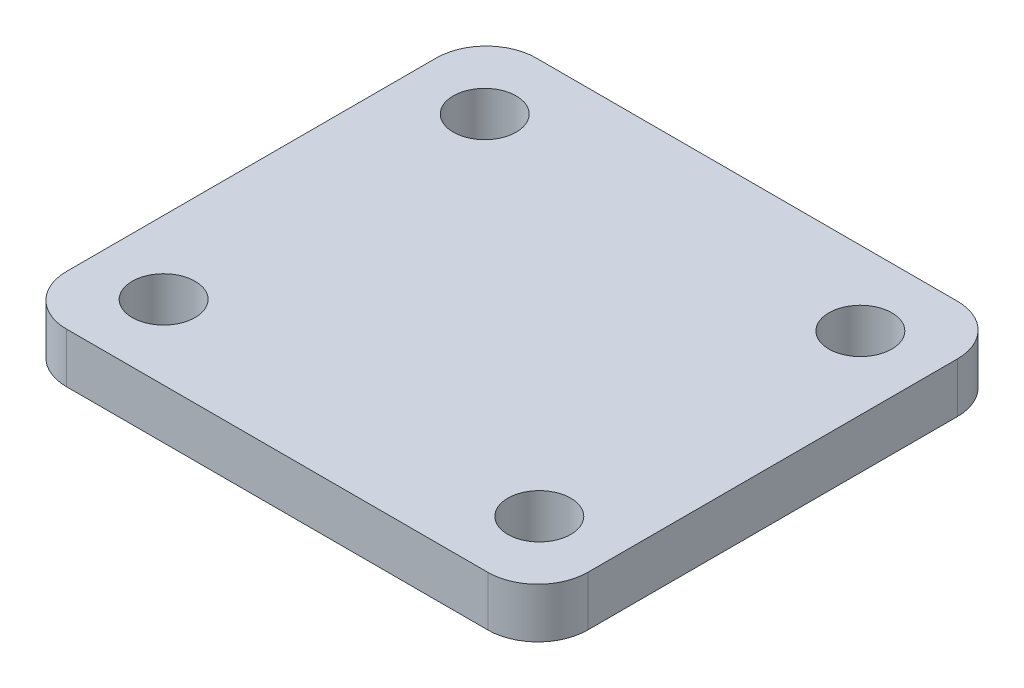
ISO-10303-21;
HEADER;
FILE_DESCRIPTION(('STEP AP214'),'2;1');
FILE_NAME('part.step','',(''),(''),'','','');
FILE_SCHEMA(('AUTOMOTIVE_DESIGN { 1 0 10303 214 1 1 1 1 }'));
ENDSEC;
DATA;
#1=APPLICATION_CONTEXT('core data for automotive mechanical design processes');
#2=APPLICATION_PROTOCOL_DEFINITION('international standard','automotive_design',2000,#1);
#3=PRODUCT_CONTEXT('',#1,'mechanical');
#4=PRODUCT('Part','Part','',(#3));
#5=PRODUCT_RELATED_PRODUCT_CATEGORY('part','',(#4));
#6=PRODUCT_DEFINITION_FORMATION('','',#4);
#7=PRODUCT_DEFINITION_CONTEXT('part definition',#1,'design');
#8=PRODUCT_DEFINITION('design','',#6,#7);
#9=PRODUCT_DEFINITION_SHAPE('','',#8);
#10=(LENGTH_UNIT() NAMED_UNIT(*) SI_UNIT(.MILLI.,.METRE.));
#11=(NAMED_UNIT(*) PLANE_ANGLE_UNIT() SI_UNIT($,.RADIAN.));
#12=(NAMED_UNIT(*) SI_UNIT($,.STERADIAN.) SOLID_ANGLE_UNIT());
#13=UNCERTAINTY_MEASURE_WITH_UNIT(LENGTH_MEASURE(1.E-05),#10,'distance_accuracy_value','');
#14=(GEOMETRIC_REPRESENTATION_CONTEXT(3) GLOBAL_UNCERTAINTY_ASSIGNED_CONTEXT((#13)) GLOBAL_UNIT_ASSIGNED_CONTEXT((#10,
#11,#12)) REPRESENTATION_CONTEXT('',''));
#15=CARTESIAN_POINT('',(0.,0.,0.));
#16=DIRECTION('',(0.,0.,1.));
#17=DIRECTION('',(1.,0.,0.));
#18=AXIS2_PLACEMENT_3D('',#15,#16,#17);
#19=CARTESIAN_POINT('',(10.709999957,2.54,-9.397499999));
#20=DIRECTION('',(0.,-1.,0.));
#21=DIRECTION('',(0.,0.,-1.));
#22=AXIS2_PLACEMENT_3D('',#19,#20,#21);
#23=CYLINDRICAL_SURFACE('',#22,2.54);
#24=CARTESIAN_POINT('',(10.709999957,0.,-9.397499999));
#25=DIRECTION('',(0.,1.,0.));
#26=DIRECTION('',(0.,0.,-1.));
#27=AXIS2_PLACEMENT_3D('',#24,#25,#26);
#28=CIRCLE('',#27,2.54);
#29=CARTESIAN_POINT('',(13.249999957,0.,-9.39749999899998));
#30=VERTEX_POINT('',#29);
#31=CARTESIAN_POINT('',(10.709999957,0.,-11.937499999));
#32=VERTEX_POINT('',#31);
#33=EDGE_CURVE('E139',#30,#32,#28,.T.);
#34=ORIENTED_EDGE('',*,*,#33,.T.);
#35=DIRECTION('',(0.,-1.,0.));
#36=VECTOR('',#35,1.);
#37=CARTESIAN_POINT('',(10.709999957,2.54,-11.937499999));
#38=LINE('',#37,#36);
#39=CARTESIAN_POINT('',(10.709999957,2.54,-11.937499999));
#40=VERTEX_POINT('',#39);
#41=EDGE_CURVE('E11',#40,#32,#38,.T.);
#42=ORIENTED_EDGE('',*,*,#41,.F.);
#43=CARTESIAN_POINT('',(10.709999957,2.54,-9.397499999));
#44=DIRECTION('',(0.,1.,0.));
#45=DIRECTION('',(0.,0.,-1.));
#46=AXIS2_PLACEMENT_3D('',#43,#44,#45);
#47=CIRCLE('',#46,2.54);
#48=CARTESIAN_POINT('',(13.249999957,2.54,-9.39749999899998));
#49=VERTEX_POINT('',#48);
#50=EDGE_CURVE('E154',#49,#40,#47,.T.);
#51=ORIENTED_EDGE('',*,*,#50,.F.);
#52=DIRECTION('',(0.,-1.,0.));
#53=VECTOR('',#52,1.);
#54=CARTESIAN_POINT('',(13.249999957,2.54,-9.39749999899998));
#55=LINE('',#54,#53);
#56=EDGE_CURVE('E135',#49,#30,#55,.T.);
#57=ORIENTED_EDGE('',*,*,#56,.T.);
#58=EDGE_LOOP('',(#34,#42,#51,#57));
#59=FACE_BOUND('',#58,.T.);
#60=ADVANCED_FACE('F43',(#59),#23,.T.);
#61=CARTESIAN_POINT('',(-10.710000043,2.54,-11.937499999));
#62=DIRECTION('',(0.,0.,1.));
#63=DIRECTION('',(1.,0.,0.));
#64=AXIS2_PLACEMENT_3D('',#61,#62,#63);
#65=PLANE('',#64);
#66=DIRECTION('',(-1.,0.,0.));
#67=VECTOR('',#66,1.);
#68=CARTESIAN_POINT('',(-10.710000043,0.,-11.937499999));
#69=LINE('',#68,#67);
#70=CARTESIAN_POINT('',(-10.710000043,0.,-11.937499999));
#71=VERTEX_POINT('',#70);
#72=EDGE_CURVE('E142',#32,#71,#69,.T.);
#73=ORIENTED_EDGE('',*,*,#72,.T.);
#74=DIRECTION('',(0.,-1.,0.));
#75=VECTOR('',#74,1.);
#76=CARTESIAN_POINT('',(-10.710000043,2.54,-11.937499999));
#77=LINE('',#76,#75);
#78=CARTESIAN_POINT('',(-10.710000043,2.54,-11.937499999));
#79=VERTEX_POINT('',#78);
#80=EDGE_CURVE('E51',#79,#71,#77,.T.);
#81=ORIENTED_EDGE('',*,*,#80,.F.);
#82=DIRECTION('',(-1.,0.,0.));
#83=VECTOR('',#82,1.);
#84=CARTESIAN_POINT('',(-10.710000043,2.54,-11.937499999));
#85=LINE('',#84,#83);
#86=EDGE_CURVE('E102',#40,#79,#85,.T.);
#87=ORIENTED_EDGE('',*,*,#86,.F.);
#88=ORIENTED_EDGE('',*,*,#41,.T.);
#89=EDGE_LOOP('',(#73,#81,#87,#88));
#90=FACE_BOUND('',#89,.T.);
#91=ADVANCED_FACE('F236',(#90),#65,.F.);
#92=CARTESIAN_POINT('',(-10.710000043,2.54,-9.397499999));
#93=DIRECTION('',(0.,-1.,0.));
#94=DIRECTION('',(0.,0.,-1.));
#95=AXIS2_PLACEMENT_3D('',#92,#93,#94);
#96=CYLINDRICAL_SURFACE('',#95,2.54);
#97=CARTESIAN_POINT('',(-10.710000043,0.,-9.397499999));
#98=DIRECTION('',(0.,1.,0.));
#99=DIRECTION('',(0.,0.,-1.));
#100=AXIS2_PLACEMENT_3D('',#97,#98,#99);
#101=CIRCLE('',#100,2.54);
#102=CARTESIAN_POINT('',(-13.250000043,0.,-9.39749999899998));
#103=VERTEX_POINT('',#102);
#104=EDGE_CURVE('E145',#71,#103,#101,.T.);
#105=ORIENTED_EDGE('',*,*,#104,.T.);
#106=DIRECTION('',(0.,-1.,0.));
#107=VECTOR('',#106,1.);
#108=CARTESIAN_POINT('',(-13.250000043,2.54,-9.39749999899998));
#109=LINE('',#108,#107);
#110=CARTESIAN_POINT('',(-13.250000043,2.54,-9.39749999899998));
#111=VERTEX_POINT('',#110);
#112=EDGE_CURVE('E161',#111,#103,#109,.T.);
#113=ORIENTED_EDGE('',*,*,#112,.F.);
#114=CARTESIAN_POINT('',(-10.710000043,2.54,-9.397499999));
#115=DIRECTION('',(0.,1.,0.));
#116=DIRECTION('',(0.,0.,-1.));
#117=AXIS2_PLACEMENT_3D('',#114,#115,#116);
#118=CIRCLE('',#117,2.54);
#119=EDGE_CURVE('E169',#79,#111,#118,.T.);
#120=ORIENTED_EDGE('',*,*,#119,.F.);
#121=ORIENTED_EDGE('',*,*,#80,.T.);
#122=EDGE_LOOP('',(#105,#113,#120,#121));
#123=FACE_BOUND('',#122,.T.);
#124=ADVANCED_FACE('F167',(#123),#96,.T.);
#125=CARTESIAN_POINT('',(-13.250000043,2.54,9.39750000099998));
#126=DIRECTION('',(1.,0.,0.));
#127=DIRECTION('',(0.,0.,-1.));
#128=AXIS2_PLACEMENT_3D('',#125,#126,#127);
#129=PLANE('',#128);
#130=DIRECTION('',(0.,0.,1.));
#131=VECTOR('',#130,1.);
#132=CARTESIAN_POINT('',(-13.250000043,0.,9.39750000099998));
#133=LINE('',#132,#131);
#134=CARTESIAN_POINT('',(-13.250000043,0.,9.39750000099998));
#135=VERTEX_POINT('',#134);
#136=EDGE_CURVE('E147',#103,#135,#133,.T.);
#137=ORIENTED_EDGE('',*,*,#136,.T.);
#138=DIRECTION('',(0.,-1.,0.));
#139=VECTOR('',#138,1.);
#140=CARTESIAN_POINT('',(-13.250000043,2.54,9.39750000099998));
#141=LINE('',#140,#139);
#142=CARTESIAN_POINT('',(-13.250000043,2.54,9.39750000099998));
#143=VERTEX_POINT('',#142);
#144=EDGE_CURVE('E158',#143,#135,#141,.T.);
#145=ORIENTED_EDGE('',*,*,#144,.F.);
#146=DIRECTION('',(0.,0.,1.));
#147=VECTOR('',#146,1.);
#148=CARTESIAN_POINT('',(-13.250000043,2.54,9.39750000099998));
#149=LINE('',#148,#147);
#150=EDGE_CURVE('E181',#111,#143,#149,.T.);
#151=ORIENTED_EDGE('',*,*,#150,.F.);
#152=ORIENTED_EDGE('',*,*,#112,.T.);
#153=EDGE_LOOP('',(#137,#145,#151,#152));
#154=FACE_BOUND('',#153,.T.);
#155=ADVANCED_FACE('F177',(#154),#129,.F.);
#156=CARTESIAN_POINT('',(-10.710000043,2.54,9.397500001));
#157=DIRECTION('',(0.,-1.,0.));
#158=DIRECTION('',(0.,0.,-1.));
#159=AXIS2_PLACEMENT_3D('',#156,#157,#158);
#160=CYLINDRICAL_SURFACE('',#159,2.54);
#161=CARTESIAN_POINT('',(-10.710000043,0.,9.397500001));
#162=DIRECTION('',(0.,1.,0.));
#163=DIRECTION('',(0.,0.,-1.));
#164=AXIS2_PLACEMENT_3D('',#161,#162,#163);
#165=CIRCLE('',#164,2.54);
#166=CARTESIAN_POINT('',(-10.710000043,0.,11.937500001));
#167=VERTEX_POINT('',#166);
#168=EDGE_CURVE('E149',#135,#167,#165,.T.);
#169=ORIENTED_EDGE('',*,*,#168,.T.);
#170=DIRECTION('',(0.,-1.,0.));
#171=VECTOR('',#170,1.);
#172=CARTESIAN_POINT('',(-10.710000043,2.54,11.937500001));
#173=LINE('',#172,#171);
#174=CARTESIAN_POINT('',(-10.710000043,2.54,11.937500001));
#175=VERTEX_POINT('',#174);
#176=EDGE_CURVE('E130',#175,#167,#173,.T.);
#177=ORIENTED_EDGE('',*,*,#176,.F.);
#178=CARTESIAN_POINT('',(-10.710000043,2.54,9.397500001));
#179=DIRECTION('',(0.,1.,0.));
#180=DIRECTION('',(0.,0.,-1.));
#181=AXIS2_PLACEMENT_3D('',#178,#179,#180);
#182=CIRCLE('',#181,2.54);
#183=EDGE_CURVE('E121',#143,#175,#182,.T.);
#184=ORIENTED_EDGE('',*,*,#183,.F.);
#185=ORIENTED_EDGE('',*,*,#144,.T.);
#186=EDGE_LOOP('',(#169,#177,#184,#185));
#187=FACE_BOUND('',#186,.T.);
#188=ADVANCED_FACE('F180',(#187),#160,.T.);
#189=CARTESIAN_POINT('',(-10.710000043,2.54,11.937500001));
#190=DIRECTION('',(0.,0.,-1.));
#191=DIRECTION('',(-1.,0.,0.));
#192=AXIS2_PLACEMENT_3D('',#189,#190,#191);
#193=PLANE('',#192);
#194=DIRECTION('',(1.,0.,0.));
#195=VECTOR('',#194,1.);
#196=CARTESIAN_POINT('',(-10.710000043,0.,11.937500001));
#197=LINE('',#196,#195);
#198=CARTESIAN_POINT('',(10.709999957,0.,11.937500001));
#199=VERTEX_POINT('',#198);
#200=EDGE_CURVE('E129',#167,#199,#197,.T.);
#201=ORIENTED_EDGE('',*,*,#200,.T.);
#202=DIRECTION('',(0.,-1.,0.));
#203=VECTOR('',#202,1.);
#204=CARTESIAN_POINT('',(10.709999957,2.54,11.937500001));
#205=LINE('',#204,#203);
#206=CARTESIAN_POINT('',(10.709999957,2.54,11.937500001));
#207=VERTEX_POINT('',#206);
#208=EDGE_CURVE('E126',#207,#199,#205,.T.);
#209=ORIENTED_EDGE('',*,*,#208,.F.);
#210=DIRECTION('',(1.,0.,0.));
#211=VECTOR('',#210,1.);
#212=CARTESIAN_POINT('',(-10.710000043,2.54,11.937500001));
#213=LINE('',#212,#211);
#214=EDGE_CURVE('E115',#175,#207,#213,.T.);
#215=ORIENTED_EDGE('',*,*,#214,.F.);
#216=ORIENTED_EDGE('',*,*,#176,.T.);
#217=EDGE_LOOP('',(#201,#209,#215,#216));
#218=FACE_BOUND('',#217,.T.);
#219=ADVANCED_FACE('F127',(#218),#193,.F.);
#220=CARTESIAN_POINT('',(10.709999957,2.54,9.397500001));
#221=DIRECTION('',(0.,-1.,0.));
#222=DIRECTION('',(0.,0.,-1.));
#223=AXIS2_PLACEMENT_3D('',#220,#221,#222);
#224=CYLINDRICAL_SURFACE('',#223,2.54);
#225=CARTESIAN_POINT('',(10.709999957,0.,9.397500001));
#226=DIRECTION('',(0.,1.,0.));
#227=DIRECTION('',(0.,0.,1.));
#228=AXIS2_PLACEMENT_3D('',#225,#226,#227);
#229=CIRCLE('',#228,2.54);
#230=CARTESIAN_POINT('',(13.249999957,0.,9.39750000099998));
#231=VERTEX_POINT('',#230);
#232=EDGE_CURVE('E88',#199,#231,#229,.T.);
#233=ORIENTED_EDGE('',*,*,#232,.T.);
#234=DIRECTION('',(0.,-1.,0.));
#235=VECTOR('',#234,1.);
#236=CARTESIAN_POINT('',(13.249999957,2.54,9.39750000099998));
#237=LINE('',#236,#235);
#238=CARTESIAN_POINT('',(13.249999957,2.54,9.39750000099998));
#239=VERTEX_POINT('',#238);
#240=EDGE_CURVE('E131',#239,#231,#237,.T.);
#241=ORIENTED_EDGE('',*,*,#240,.F.);
#242=CARTESIAN_POINT('',(10.709999957,2.54,9.397500001));
#243=DIRECTION('',(0.,1.,0.));
#244=DIRECTION('',(0.,0.,1.));
#245=AXIS2_PLACEMENT_3D('',#242,#243,#244);
#246=CIRCLE('',#245,2.54);
#247=EDGE_CURVE('E119',#207,#239,#246,.T.);
#248=ORIENTED_EDGE('',*,*,#247,.F.);
#249=ORIENTED_EDGE('',*,*,#208,.T.);
#250=EDGE_LOOP('',(#233,#241,#248,#249));
#251=FACE_BOUND('',#250,.T.);
#252=ADVANCED_FACE('F133',(#251),#224,.T.);
#253=CARTESIAN_POINT('',(13.249999957,2.54,9.39750000099998));
#254=DIRECTION('',(-1.,0.,0.));
#255=DIRECTION('',(0.,0.,1.));
#256=AXIS2_PLACEMENT_3D('',#253,#254,#255);
#257=PLANE('',#256);
#258=DIRECTION('',(0.,0.,-1.));
#259=VECTOR('',#258,1.);
#260=CARTESIAN_POINT('',(13.249999957,0.,9.39750000099998));
#261=LINE('',#260,#259);
#262=EDGE_CURVE('E94',#231,#30,#261,.T.);
#263=ORIENTED_EDGE('',*,*,#262,.T.);
#264=ORIENTED_EDGE('',*,*,#56,.F.);
#265=DIRECTION('',(0.,0.,-1.));
#266=VECTOR('',#265,1.);
#267=CARTESIAN_POINT('',(13.249999957,2.54,9.39750000099998));
#268=LINE('',#267,#266);
#269=EDGE_CURVE('E59',#239,#49,#268,.T.);
#270=ORIENTED_EDGE('',*,*,#269,.F.);
#271=ORIENTED_EDGE('',*,*,#240,.T.);
#272=EDGE_LOOP('',(#263,#264,#270,#271));
#273=FACE_BOUND('',#272,.T.);
#274=ADVANCED_FACE('F215',(#273),#257,.F.);
#275=CARTESIAN_POINT('',(10.709999957,2.54,-9.397499999));
#276=DIRECTION('',(0.,-1.,0.));
#277=DIRECTION('',(0.,0.,-1.));
#278=AXIS2_PLACEMENT_3D('',#275,#276,#277);
#279=PLANE('',#278);
#280=CARTESIAN_POINT('',(-9.54999995,2.54,8.162499942));
#281=DIRECTION('',(0.,1.,0.));
#282=DIRECTION('',(0.,0.,1.));
#283=AXIS2_PLACEMENT_3D('',#280,#281,#282);
#284=CIRCLE('',#283,1.6);
#285=CARTESIAN_POINT('',(-9.54999995,2.54,9.762499942));
#286=VERTEX_POINT('',#285);
#287=EDGE_CURVE('E196',#286,#286,#284,.T.);
#288=ORIENTED_EDGE('',*,*,#287,.F.);
#289=EDGE_LOOP('',(#288));
#290=FACE_BOUND('',#289,.T.);
#291=CARTESIAN_POINT('',(9.55000005,2.54,8.162499942));
#292=DIRECTION('',(0.,1.,0.));
#293=DIRECTION('',(0.,0.,1.));
#294=AXIS2_PLACEMENT_3D('',#291,#292,#293);
#295=CIRCLE('',#294,1.6);
#296=CARTESIAN_POINT('',(9.55000005,2.54,9.762499942));
#297=VERTEX_POINT('',#296);
#298=EDGE_CURVE('E202',#297,#297,#295,.T.);
#299=ORIENTED_EDGE('',*,*,#298,.F.);
#300=EDGE_LOOP('',(#299));
#301=FACE_BOUND('',#300,.T.);
#302=CARTESIAN_POINT('',(9.55000005,2.54,-8.162500058));
#303=DIRECTION('',(0.,1.,0.));
#304=DIRECTION('',(0.,0.,1.));
#305=AXIS2_PLACEMENT_3D('',#302,#303,#304);
#306=CIRCLE('',#305,1.6);
#307=CARTESIAN_POINT('',(9.55000005,2.54,-6.562500058));
#308=VERTEX_POINT('',#307);
#309=EDGE_CURVE('E190',#308,#308,#306,.T.);
#310=ORIENTED_EDGE('',*,*,#309,.F.);
#311=EDGE_LOOP('',(#310));
#312=FACE_BOUND('',#311,.T.);
#313=CARTESIAN_POINT('',(-9.54999995,2.54,-8.162500058));
#314=DIRECTION('',(0.,1.,0.));
#315=DIRECTION('',(0.,0.,1.));
#316=AXIS2_PLACEMENT_3D('',#313,#314,#315);
#317=CIRCLE('',#316,1.6);
#318=CARTESIAN_POINT('',(-9.54999995,2.54,-6.562500058));
#319=VERTEX_POINT('',#318);
#320=EDGE_CURVE('E187',#319,#319,#317,.T.);
#321=ORIENTED_EDGE('',*,*,#320,.F.);
#322=EDGE_LOOP('',(#321));
#323=FACE_BOUND('',#322,.T.);
#324=ORIENTED_EDGE('',*,*,#50,.T.);
#325=ORIENTED_EDGE('',*,*,#86,.T.);
#326=ORIENTED_EDGE('',*,*,#119,.T.);
#327=ORIENTED_EDGE('',*,*,#150,.T.);
#328=ORIENTED_EDGE('',*,*,#183,.T.);
#329=ORIENTED_EDGE('',*,*,#214,.T.);
#330=ORIENTED_EDGE('',*,*,#247,.T.);
#331=ORIENTED_EDGE('',*,*,#269,.T.);
#332=EDGE_LOOP('',(#324,#325,#326,#327,#328,#329,#330,#331));
#333=FACE_BOUND('',#332,.T.);
#334=ADVANCED_FACE('F117',(#290,#301,#312,#323,#333),#279,.F.);
#335=CARTESIAN_POINT('',(10.709999957,0.,-9.397499999));
#336=DIRECTION('',(0.,-1.,0.));
#337=DIRECTION('',(0.,0.,-1.));
#338=AXIS2_PLACEMENT_3D('',#335,#336,#337);
#339=PLANE('',#338);
#340=CARTESIAN_POINT('',(-9.54999995,0.,8.162499942));
#341=DIRECTION('',(0.,1.,0.));
#342=DIRECTION('',(0.,0.,1.));
#343=AXIS2_PLACEMENT_3D('',#340,#341,#342);
#344=CIRCLE('',#343,1.6);
#345=CARTESIAN_POINT('',(-9.54999995,0.,9.762499942));
#346=VERTEX_POINT('',#345);
#347=EDGE_CURVE('E193',#346,#346,#344,.T.);
#348=ORIENTED_EDGE('',*,*,#347,.T.);
#349=EDGE_LOOP('',(#348));
#350=FACE_BOUND('',#349,.T.);
#351=CARTESIAN_POINT('',(9.55000005,0.,8.162499942));
#352=DIRECTION('',(0.,1.,0.));
#353=DIRECTION('',(0.,0.,1.));
#354=AXIS2_PLACEMENT_3D('',#351,#352,#353);
#355=CIRCLE('',#354,1.6);
#356=CARTESIAN_POINT('',(9.55000005,0.,9.762499942));
#357=VERTEX_POINT('',#356);
#358=EDGE_CURVE('E199',#357,#357,#355,.T.);
#359=ORIENTED_EDGE('',*,*,#358,.T.);
#360=EDGE_LOOP('',(#359));
#361=FACE_BOUND('',#360,.T.);
#362=CARTESIAN_POINT('',(9.55000005,0.,-8.162500058));
#363=DIRECTION('',(0.,1.,0.));
#364=DIRECTION('',(0.,0.,1.));
#365=AXIS2_PLACEMENT_3D('',#362,#363,#364);
#366=CIRCLE('',#365,1.6);
#367=CARTESIAN_POINT('',(9.55000005,0.,-6.562500058));
#368=VERTEX_POINT('',#367);
#369=EDGE_CURVE('E205',#368,#368,#366,.T.);
#370=ORIENTED_EDGE('',*,*,#369,.T.);
#371=EDGE_LOOP('',(#370));
#372=FACE_BOUND('',#371,.T.);
#373=CARTESIAN_POINT('',(-9.54999995,0.,-8.162500058));
#374=DIRECTION('',(0.,1.,0.));
#375=DIRECTION('',(0.,0.,1.));
#376=AXIS2_PLACEMENT_3D('',#373,#374,#375);
#377=CIRCLE('',#376,1.6);
#378=CARTESIAN_POINT('',(-9.54999995,0.,-6.562500058));
#379=VERTEX_POINT('',#378);
#380=EDGE_CURVE('E143',#379,#379,#377,.T.);
#381=ORIENTED_EDGE('',*,*,#380,.T.);
#382=EDGE_LOOP('',(#381));
#383=FACE_BOUND('',#382,.T.);
#384=ORIENTED_EDGE('',*,*,#33,.F.);
#385=ORIENTED_EDGE('',*,*,#262,.F.);
#386=ORIENTED_EDGE('',*,*,#232,.F.);
#387=ORIENTED_EDGE('',*,*,#200,.F.);
#388=ORIENTED_EDGE('',*,*,#168,.F.);
#389=ORIENTED_EDGE('',*,*,#136,.F.);
#390=ORIENTED_EDGE('',*,*,#104,.F.);
#391=ORIENTED_EDGE('',*,*,#72,.F.);
#392=EDGE_LOOP('',(#384,#385,#386,#387,#388,#389,#390,#391));
#393=FACE_BOUND('',#392,.T.);
#394=ADVANCED_FACE('F173',(#350,#361,#372,#383,#393),#339,.T.);
#395=CARTESIAN_POINT('',(-9.54999995,0.,-8.162500058));
#396=DIRECTION('',(0.,1.,0.));
#397=DIRECTION('',(0.,0.,1.));
#398=AXIS2_PLACEMENT_3D('',#395,#396,#397);
#399=CYLINDRICAL_SURFACE('',#398,1.6);
#400=ORIENTED_EDGE('',*,*,#380,.F.);
#401=EDGE_LOOP('',(#400));
#402=FACE_BOUND('',#401,.T.);
#403=ORIENTED_EDGE('',*,*,#320,.T.);
#404=EDGE_LOOP('',(#403));
#405=FACE_BOUND('',#404,.T.);
#406=ADVANCED_FACE('F220',(#402,#405),#399,.F.);
#407=CARTESIAN_POINT('',(9.55000005,0.,-8.162500058));
#408=DIRECTION('',(0.,1.,0.));
#409=DIRECTION('',(0.,0.,1.));
#410=AXIS2_PLACEMENT_3D('',#407,#408,#409);
#411=CYLINDRICAL_SURFACE('',#410,1.6);
#412=ORIENTED_EDGE('',*,*,#369,.F.);
#413=EDGE_LOOP('',(#412));
#414=FACE_BOUND('',#413,.T.);
#415=ORIENTED_EDGE('',*,*,#309,.T.);
#416=EDGE_LOOP('',(#415));
#417=FACE_BOUND('',#416,.T.);
#418=ADVANCED_FACE('F211',(#414,#417),#411,.F.);
#419=CARTESIAN_POINT('',(9.55000005,0.,8.162499942));
#420=DIRECTION('',(0.,1.,0.));
#421=DIRECTION('',(0.,0.,1.));
#422=AXIS2_PLACEMENT_3D('',#419,#420,#421);
#423=CYLINDRICAL_SURFACE('',#422,1.6);
#424=ORIENTED_EDGE('',*,*,#358,.F.);
#425=EDGE_LOOP('',(#424));
#426=FACE_BOUND('',#425,.T.);
#427=ORIENTED_EDGE('',*,*,#298,.T.);
#428=EDGE_LOOP('',(#427));
#429=FACE_BOUND('',#428,.T.);
#430=ADVANCED_FACE('F228',(#426,#429),#423,.F.);
#431=CARTESIAN_POINT('',(-9.54999995,0.,8.162499942));
#432=DIRECTION('',(0.,1.,0.));
#433=DIRECTION('',(0.,0.,1.));
#434=AXIS2_PLACEMENT_3D('',#431,#432,#433);
#435=CYLINDRICAL_SURFACE('',#434,1.6);
#436=ORIENTED_EDGE('',*,*,#347,.F.);
#437=EDGE_LOOP('',(#436));
#438=FACE_BOUND('',#437,.T.);
#439=ORIENTED_EDGE('',*,*,#287,.T.);
#440=EDGE_LOOP('',(#439));
#441=FACE_BOUND('',#440,.T.);
#442=ADVANCED_FACE('F317',(#438,#441),#435,.F.);
#443=CLOSED_SHELL('',(#60,#91,#124,#155,#188,#219,#252,#274,#334,#394,#406,#418,#430,#442));
#444=MANIFOLD_SOLID_BREP('B2',#443);
#445=ADVANCED_BREP_SHAPE_REPRESENTATION('',(#18,#444),#14);
#446=SHAPE_DEFINITION_REPRESENTATION(#9,#445);
ENDSEC;
END-ISO-10303-21;
